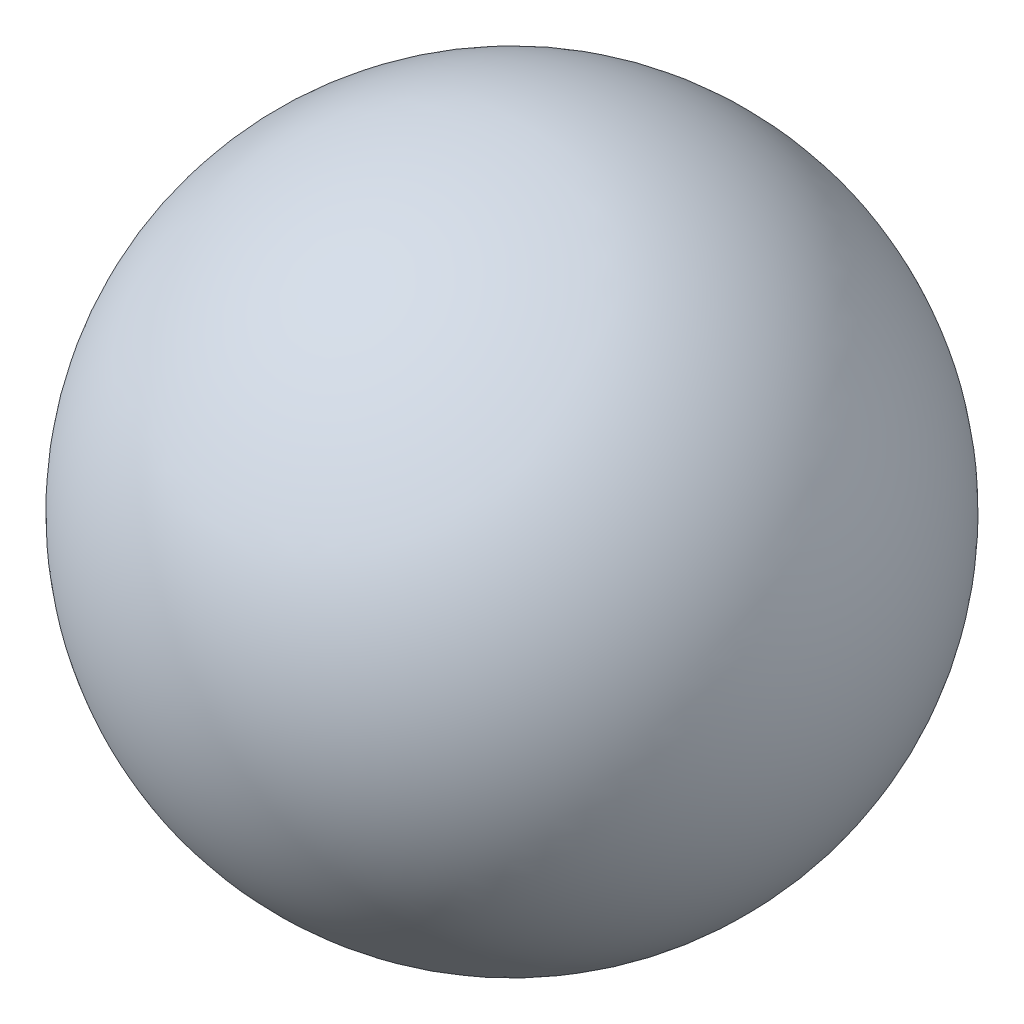
ISO-10303-21;
HEADER;
FILE_DESCRIPTION(('STEP AP214'),'2;1');
FILE_NAME('part.step','',(''),(''),'','','');
FILE_SCHEMA(('AUTOMOTIVE_DESIGN { 1 0 10303 214 1 1 1 1 }'));
ENDSEC;
DATA;
#1=APPLICATION_CONTEXT('core data for automotive mechanical design processes');
#2=APPLICATION_PROTOCOL_DEFINITION('international standard','automotive_design',2000,#1);
#3=PRODUCT_CONTEXT('',#1,'mechanical');
#4=PRODUCT('Part','Part','',(#3));
#5=PRODUCT_RELATED_PRODUCT_CATEGORY('part','',(#4));
#6=PRODUCT_DEFINITION_FORMATION('','',#4);
#7=PRODUCT_DEFINITION_CONTEXT('part definition',#1,'design');
#8=PRODUCT_DEFINITION('design','',#6,#7);
#9=PRODUCT_DEFINITION_SHAPE('','',#8);
#10=(LENGTH_UNIT() NAMED_UNIT(*) SI_UNIT(.MILLI.,.METRE.));
#11=(NAMED_UNIT(*) PLANE_ANGLE_UNIT() SI_UNIT($,.RADIAN.));
#12=(NAMED_UNIT(*) SI_UNIT($,.STERADIAN.) SOLID_ANGLE_UNIT());
#13=UNCERTAINTY_MEASURE_WITH_UNIT(LENGTH_MEASURE(1.E-05),#10,'distance_accuracy_value','');
#14=(GEOMETRIC_REPRESENTATION_CONTEXT(3) GLOBAL_UNCERTAINTY_ASSIGNED_CONTEXT((#13)) GLOBAL_UNIT_ASSIGNED_CONTEXT((#10,
#11,#12)) REPRESENTATION_CONTEXT('',''));
#15=CARTESIAN_POINT('',(0.,0.,0.));
#16=DIRECTION('',(0.,0.,1.));
#17=DIRECTION('',(1.,0.,0.));
#18=AXIS2_PLACEMENT_3D('',#15,#16,#17);
#19=CARTESIAN_POINT('',(0.,0.,0.));
#20=DIRECTION('',(0.,0.,-1.));
#21=DIRECTION('',(1.,0.,0.));
#22=AXIS2_PLACEMENT_3D('',#19,#20,#21);
#23=SPHERICAL_SURFACE('',#22,26.4);
#24=CARTESIAN_POINT('',(0.,0.,-26.4));
#25=VERTEX_POINT('',#24);
#26=VERTEX_LOOP('',#25);
#27=FACE_BOUND('',#26,.T.);
#28=ADVANCED_FACE('F30',(#27),#23,.T.);
#29=CLOSED_SHELL('',(#28));
#30=CARTESIAN_POINT('',(0.,0.,0.));
#31=DIRECTION('',(0.,0.,-1.));
#32=DIRECTION('',(1.,0.,0.));
#33=AXIS2_PLACEMENT_3D('',#30,#31,#32);
#34=SPHERICAL_SURFACE('',#33,25.4);
#35=CARTESIAN_POINT('',(0.,0.,-25.4));
#36=VERTEX_POINT('',#35);
#37=VERTEX_LOOP('',#36);
#38=FACE_BOUND('',#37,.T.);
#39=ADVANCED_FACE('F43',(#38),#34,.F.);
#40=CLOSED_SHELL('',(#39));
#41=ORIENTED_CLOSED_SHELL('',*,#40,.T.);
#42=BREP_WITH_VOIDS('B2',#29,(#41));
#43=ADVANCED_BREP_SHAPE_REPRESENTATION('',(#18,#42),#14);
#44=SHAPE_DEFINITION_REPRESENTATION(#9,#43);
ENDSEC;
END-ISO-10303-21;
